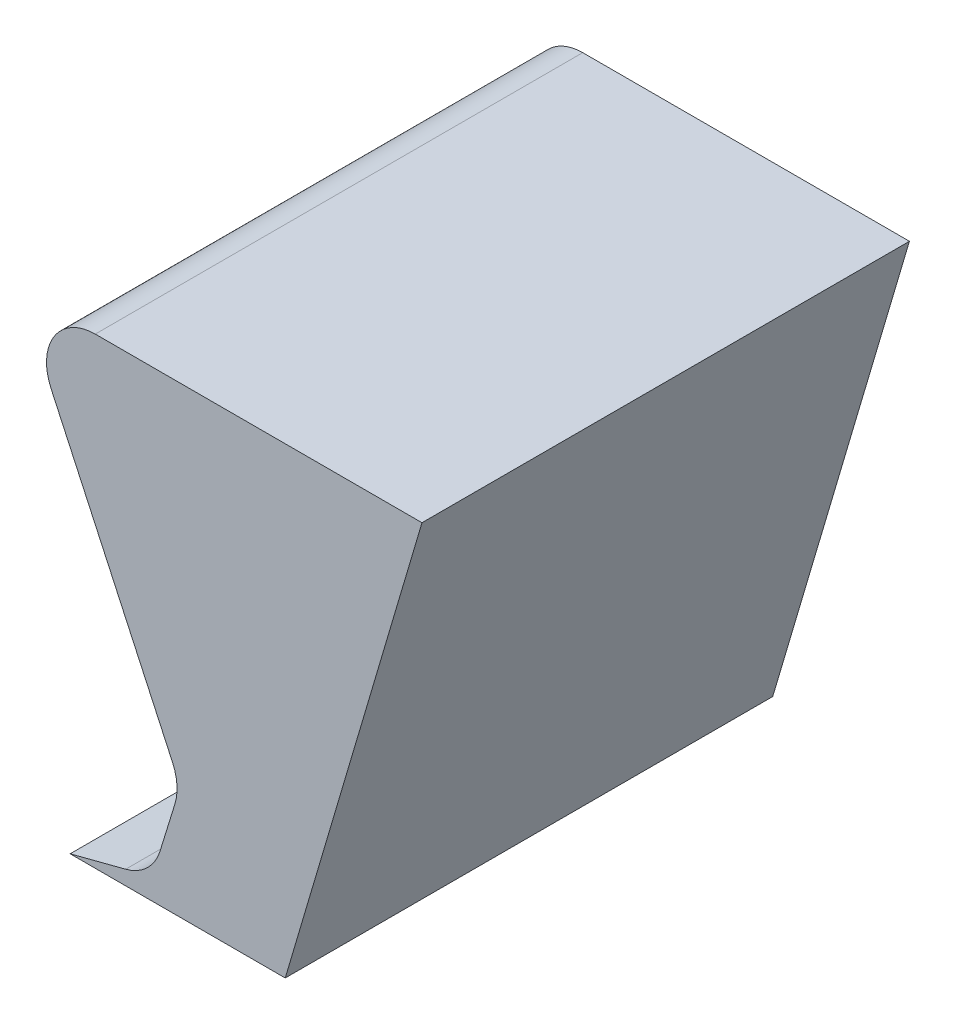
ISO-10303-21;
HEADER;
FILE_DESCRIPTION(('STEP AP214'),'2;1');
FILE_NAME('part.step','',(''),(''),'','','');
FILE_SCHEMA(('AUTOMOTIVE_DESIGN { 1 0 10303 214 1 1 1 1 }'));
ENDSEC;
DATA;
#1=APPLICATION_CONTEXT('core data for automotive mechanical design processes');
#2=APPLICATION_PROTOCOL_DEFINITION('international standard','automotive_design',2000,#1);
#3=PRODUCT_CONTEXT('',#1,'mechanical');
#4=PRODUCT('Part','Part','',(#3));
#5=PRODUCT_RELATED_PRODUCT_CATEGORY('part','',(#4));
#6=PRODUCT_DEFINITION_FORMATION('','',#4);
#7=PRODUCT_DEFINITION_CONTEXT('part definition',#1,'design');
#8=PRODUCT_DEFINITION('design','',#6,#7);
#9=PRODUCT_DEFINITION_SHAPE('','',#8);
#10=(LENGTH_UNIT() NAMED_UNIT(*) SI_UNIT(.MILLI.,.METRE.));
#11=(NAMED_UNIT(*) PLANE_ANGLE_UNIT() SI_UNIT($,.RADIAN.));
#12=(NAMED_UNIT(*) SI_UNIT($,.STERADIAN.) SOLID_ANGLE_UNIT());
#13=UNCERTAINTY_MEASURE_WITH_UNIT(LENGTH_MEASURE(1.E-05),#10,'distance_accuracy_value','');
#14=(GEOMETRIC_REPRESENTATION_CONTEXT(3) GLOBAL_UNCERTAINTY_ASSIGNED_CONTEXT((#13)) GLOBAL_UNIT_ASSIGNED_CONTEXT((#10,
#11,#12)) REPRESENTATION_CONTEXT('',''));
#15=CARTESIAN_POINT('',(0.,0.,0.));
#16=DIRECTION('',(0.,0.,1.));
#17=DIRECTION('',(1.,0.,0.));
#18=AXIS2_PLACEMENT_3D('',#15,#16,#17);
#19=CARTESIAN_POINT('',(-2.322032823295,-1.888104528849,0.));
#20=DIRECTION('',(0.,0.,1.));
#21=DIRECTION('',(0.69099336840186,-0.722861096494099,0.));
#22=AXIS2_PLACEMENT_3D('',#19,#20,#21);
#23=CYLINDRICAL_SURFACE('',#22,0.01);
#24=CARTESIAN_POINT('',(-2.322032823295,-1.888104528849,0.));
#25=DIRECTION('',(0.,0.,-1.));
#26=DIRECTION('',(0.69099336840186,-0.722861096494099,0.));
#27=AXIS2_PLACEMENT_3D('',#24,#25,#26);
#28=CIRCLE('',#27,0.01);
#29=CARTESIAN_POINT('',(-2.312477161526,-1.891052295487,0.));
#30=VERTEX_POINT('',#29);
#31=CARTESIAN_POINT('',(-2.319518593314,-1.897783301891,0.));
#32=VERTEX_POINT('',#31);
#33=EDGE_CURVE('E11',#30,#32,#28,.T.);
#34=ORIENTED_EDGE('',*,*,#33,.T.);
#35=DIRECTION('',(0.,0.,1.));
#36=VECTOR('',#35,1.);
#37=CARTESIAN_POINT('',(-2.319518593314,-1.897783301891,0.));
#38=LINE('',#37,#36);
#39=CARTESIAN_POINT('',(-2.319518593314,-1.897783301891,0.1));
#40=VERTEX_POINT('',#39);
#41=EDGE_CURVE('E24',#32,#40,#38,.T.);
#42=ORIENTED_EDGE('',*,*,#41,.T.);
#43=CARTESIAN_POINT('',(-2.322032823295,-1.888104528849,0.1));
#44=DIRECTION('',(0.,0.,1.));
#45=DIRECTION('',(0.69099336840186,-0.722861096494099,0.));
#46=AXIS2_PLACEMENT_3D('',#43,#44,#45);
#47=CIRCLE('',#46,0.01);
#48=CARTESIAN_POINT('',(-2.312477161526,-1.891052295487,0.1));
#49=VERTEX_POINT('',#48);
#50=EDGE_CURVE('E160',#40,#49,#47,.T.);
#51=ORIENTED_EDGE('',*,*,#50,.T.);
#52=DIRECTION('',(0.,0.,-1.));
#53=VECTOR('',#52,1.);
#54=CARTESIAN_POINT('',(-2.312477161526,-1.891052295487,0.));
#55=LINE('',#54,#53);
#56=EDGE_CURVE('E36',#49,#30,#55,.T.);
#57=ORIENTED_EDGE('',*,*,#56,.T.);
#58=EDGE_LOOP('',(#34,#42,#51,#57));
#59=FACE_BOUND('',#58,.T.);
#60=ADVANCED_FACE('F17',(#59),#23,.F.);
#61=CARTESIAN_POINT('',(-2.314121040074,-1.896381193368,0.));
#62=DIRECTION('',(-0.251422998089573,0.967877304223862,0.));
#63=DIRECTION('',(-0.967877304223862,-0.251422998089573,0.));
#64=AXIS2_PLACEMENT_3D('',#61,#62,#63);
#65=PLANE('',#64);
#66=ORIENTED_EDGE('',*,*,#41,.F.);
#67=DIRECTION('',(-0.967877304223862,-0.251422998089573,0.));
#68=VECTOR('',#67,1.);
#69=CARTESIAN_POINT('',(-2.314121040074,-1.896381193368,0.));
#70=LINE('',#69,#68);
#71=CARTESIAN_POINT('',(-2.33092192226,-1.900745515324,0.));
#72=VERTEX_POINT('',#71);
#73=EDGE_CURVE('E157',#32,#72,#70,.T.);
#74=ORIENTED_EDGE('',*,*,#73,.T.);
#75=DIRECTION('',(0.,0.,1.));
#76=VECTOR('',#75,1.);
#77=CARTESIAN_POINT('',(-2.33092192226,-1.900745515324,0.));
#78=LINE('',#77,#76);
#79=CARTESIAN_POINT('',(-2.33092192226,-1.900745515324,0.1));
#80=VERTEX_POINT('',#79);
#81=EDGE_CURVE('E109',#72,#80,#78,.T.);
#82=ORIENTED_EDGE('',*,*,#81,.T.);
#83=DIRECTION('',(-0.967877304223862,-0.251422998089573,0.));
#84=VECTOR('',#83,1.);
#85=CARTESIAN_POINT('',(-2.314121040074,-1.896381193368,0.1));
#86=LINE('',#85,#84);
#87=EDGE_CURVE('E153',#40,#80,#86,.T.);
#88=ORIENTED_EDGE('',*,*,#87,.F.);
#89=EDGE_LOOP('',(#66,#74,#82,#88));
#90=FACE_BOUND('',#89,.T.);
#91=ADVANCED_FACE('F161',(#90),#65,.T.);
#92=CARTESIAN_POINT('',(-2.318981173884,-1.878212114289,0.));
#93=DIRECTION('',(0.,0.,1.));
#94=DIRECTION('',(0.997774022680353,0.066685828061636,0.));
#95=AXIS2_PLACEMENT_3D('',#92,#93,#94);
#96=CYLINDRICAL_SURFACE('',#95,0.01);
#97=CARTESIAN_POINT('',(-2.318981173884,-1.878212114289,0.));
#98=DIRECTION('',(0.,0.,-1.));
#99=DIRECTION('',(0.997774022680353,0.066685828061636,0.));
#100=AXIS2_PLACEMENT_3D('',#97,#98,#99);
#101=CIRCLE('',#100,0.01);
#102=CARTESIAN_POINT('',(-2.309902773543,-1.874018947556,0.));
#103=VERTEX_POINT('',#102);
#104=CARTESIAN_POINT('',(-2.309425512115,-1.881159880927,0.));
#105=VERTEX_POINT('',#104);
#106=EDGE_CURVE('E150',#103,#105,#101,.T.);
#107=ORIENTED_EDGE('',*,*,#106,.T.);
#108=DIRECTION('',(0.,0.,1.));
#109=VECTOR('',#108,1.);
#110=CARTESIAN_POINT('',(-2.309425512115,-1.881159880927,0.));
#111=LINE('',#110,#109);
#112=CARTESIAN_POINT('',(-2.309425512115,-1.881159880927,0.1));
#113=VERTEX_POINT('',#112);
#114=EDGE_CURVE('E147',#105,#113,#111,.T.);
#115=ORIENTED_EDGE('',*,*,#114,.T.);
#116=CARTESIAN_POINT('',(-2.318981173884,-1.878212114289,0.1));
#117=DIRECTION('',(0.,0.,1.));
#118=DIRECTION('',(0.997774022680353,0.066685828061636,0.));
#119=AXIS2_PLACEMENT_3D('',#116,#117,#118);
#120=CIRCLE('',#119,0.01);
#121=CARTESIAN_POINT('',(-2.309902773543,-1.874018947556,0.1));
#122=VERTEX_POINT('',#121);
#123=EDGE_CURVE('E144',#113,#122,#120,.T.);
#124=ORIENTED_EDGE('',*,*,#123,.T.);
#125=DIRECTION('',(0.,0.,-1.));
#126=VECTOR('',#125,1.);
#127=CARTESIAN_POINT('',(-2.309902773543,-1.874018947556,0.));
#128=LINE('',#127,#126);
#129=EDGE_CURVE('E142',#122,#103,#128,.T.);
#130=ORIENTED_EDGE('',*,*,#129,.T.);
#131=EDGE_LOOP('',(#107,#115,#124,#130));
#132=FACE_BOUND('',#131,.T.);
#133=ADVANCED_FACE('F194',(#132),#96,.F.);
#134=CARTESIAN_POINT('',(-2.308295870868,-1.877497966332,0.));
#135=DIRECTION('',(-0.955566176917726,0.294776663816594,0.));
#136=DIRECTION('',(-0.294776663816594,-0.955566176917726,0.));
#137=AXIS2_PLACEMENT_3D('',#134,#135,#136);
#138=PLANE('',#137);
#139=ORIENTED_EDGE('',*,*,#56,.F.);
#140=DIRECTION('',(-0.294776663816594,-0.955566176917726,0.));
#141=VECTOR('',#140,1.);
#142=CARTESIAN_POINT('',(-2.308295870868,-1.877497966332,0.1));
#143=LINE('',#142,#141);
#144=EDGE_CURVE('E139',#113,#49,#143,.T.);
#145=ORIENTED_EDGE('',*,*,#144,.F.);
#146=ORIENTED_EDGE('',*,*,#114,.F.);
#147=DIRECTION('',(-0.294776663816594,-0.955566176917726,0.));
#148=VECTOR('',#147,1.);
#149=CARTESIAN_POINT('',(-2.308295870868,-1.877497966332,0.));
#150=LINE('',#149,#148);
#151=EDGE_CURVE('E136',#105,#30,#150,.T.);
#152=ORIENTED_EDGE('',*,*,#151,.T.);
#153=EDGE_LOOP('',(#139,#145,#146,#152));
#154=FACE_BOUND('',#153,.T.);
#155=ADVANCED_FACE('F166',(#154),#138,.T.);
#156=CARTESIAN_POINT('',(-2.325763158544,-1.815832154574,0.));
#157=DIRECTION('',(0.,0.,1.));
#158=DIRECTION('',(-0.842412213008179,0.538833613812894,0.));
#159=AXIS2_PLACEMENT_3D('',#156,#157,#158);
#160=CYLINDRICAL_SURFACE('',#159,0.01);
#161=CARTESIAN_POINT('',(-2.325763158544,-1.815832154574,0.1));
#162=DIRECTION('',(0.,0.,-1.));
#163=DIRECTION('',(-0.842412213008179,0.538833613812894,0.));
#164=AXIS2_PLACEMENT_3D('',#161,#162,#163);
#165=CIRCLE('',#164,0.01);
#166=CARTESIAN_POINT('',(-2.334841558885,-1.820025321306,0.1));
#167=VERTEX_POINT('',#166);
#168=CARTESIAN_POINT('',(-2.325763158544,-1.805832154574,0.1));
#169=VERTEX_POINT('',#168);
#170=EDGE_CURVE('E134',#167,#169,#165,.T.);
#171=ORIENTED_EDGE('',*,*,#170,.T.);
#172=DIRECTION('',(0.,0.,-1.));
#173=VECTOR('',#172,1.);
#174=CARTESIAN_POINT('',(-2.325763158544,-1.805832154574,0.));
#175=LINE('',#174,#173);
#176=CARTESIAN_POINT('',(-2.325763158544,-1.805832154574,0.));
#177=VERTEX_POINT('',#176);
#178=EDGE_CURVE('E132',#169,#177,#175,.T.);
#179=ORIENTED_EDGE('',*,*,#178,.T.);
#180=CARTESIAN_POINT('',(-2.325763158544,-1.815832154574,0.));
#181=DIRECTION('',(0.,0.,1.));
#182=DIRECTION('',(-0.842412213008179,0.538833613812894,0.));
#183=AXIS2_PLACEMENT_3D('',#180,#181,#182);
#184=CIRCLE('',#183,0.01);
#185=CARTESIAN_POINT('',(-2.334841558885,-1.820025321306,0.));
#186=VERTEX_POINT('',#185);
#187=EDGE_CURVE('E130',#177,#186,#184,.T.);
#188=ORIENTED_EDGE('',*,*,#187,.T.);
#189=DIRECTION('',(0.,0.,1.));
#190=VECTOR('',#189,1.);
#191=CARTESIAN_POINT('',(-2.334841558885,-1.820025321306,0.));
#192=LINE('',#191,#190);
#193=EDGE_CURVE('E127',#186,#167,#192,.T.);
#194=ORIENTED_EDGE('',*,*,#193,.T.);
#195=EDGE_LOOP('',(#171,#179,#188,#194));
#196=FACE_BOUND('',#195,.T.);
#197=ADVANCED_FACE('F176',(#196),#160,.T.);
#198=CARTESIAN_POINT('',(-2.300803726353,-1.849500161908,0.1));
#199=DIRECTION('',(0.,0.,1.));
#200=DIRECTION('',(1.,0.,0.));
#201=AXIS2_PLACEMENT_3D('',#198,#199,#200);
#202=PLANE('',#201);
#203=ORIENTED_EDGE('',*,*,#170,.F.);
#204=DIRECTION('',(0.419316673250586,-0.907840034110669,0.));
#205=VECTOR('',#204,1.);
#206=CARTESIAN_POINT('',(-2.341397153741,-1.805832154574,0.1));
#207=LINE('',#206,#205);
#208=EDGE_CURVE('E124',#167,#122,#207,.T.);
#209=ORIENTED_EDGE('',*,*,#208,.T.);
#210=ORIENTED_EDGE('',*,*,#123,.F.);
#211=ORIENTED_EDGE('',*,*,#144,.T.);
#212=ORIENTED_EDGE('',*,*,#50,.F.);
#213=ORIENTED_EDGE('',*,*,#87,.T.);
#214=DIRECTION('',(1.,0.,0.));
#215=VECTOR('',#214,1.);
#216=CARTESIAN_POINT('',(-2.33092192226,-1.900745515324,0.1));
#217=LINE('',#216,#215);
#218=CARTESIAN_POINT('',(-2.286790058151,-1.900745515324,0.1));
#219=VERTEX_POINT('',#218);
#220=EDGE_CURVE('E122',#80,#219,#217,.T.);
#221=ORIENTED_EDGE('',*,*,#220,.T.);
#222=DIRECTION('',(0.283427278082506,0.958993732012228,0.));
#223=VECTOR('',#222,1.);
#224=CARTESIAN_POINT('',(-2.286790058151,-1.900745515324,0.1));
#225=LINE('',#224,#223);
#226=CARTESIAN_POINT('',(-2.258738742909,-1.805832154574,0.1));
#227=VERTEX_POINT('',#226);
#228=EDGE_CURVE('E103',#219,#227,#225,.T.);
#229=ORIENTED_EDGE('',*,*,#228,.T.);
#230=DIRECTION('',(-1.,0.,0.));
#231=VECTOR('',#230,1.);
#232=CARTESIAN_POINT('',(-2.258738742909,-1.805832154574,0.1));
#233=LINE('',#232,#231);
#234=EDGE_CURVE('E118',#227,#169,#233,.T.);
#235=ORIENTED_EDGE('',*,*,#234,.T.);
#236=EDGE_LOOP('',(#203,#209,#210,#211,#212,#213,#221,#229,#235));
#237=FACE_BOUND('',#236,.T.);
#238=ADVANCED_FACE('F163',(#237),#202,.T.);
#239=CARTESIAN_POINT('',(-2.341397153741,-1.805832154574,0.));
#240=DIRECTION('',(-0.907840034110669,-0.419316673250586,0.));
#241=DIRECTION('',(0.419316673250586,-0.907840034110669,0.));
#242=AXIS2_PLACEMENT_3D('',#239,#240,#241);
#243=PLANE('',#242);
#244=ORIENTED_EDGE('',*,*,#129,.F.);
#245=ORIENTED_EDGE('',*,*,#208,.F.);
#246=ORIENTED_EDGE('',*,*,#193,.F.);
#247=DIRECTION('',(0.419316673250586,-0.907840034110669,0.));
#248=VECTOR('',#247,1.);
#249=CARTESIAN_POINT('',(-2.341397153741,-1.805832154574,0.));
#250=LINE('',#249,#248);
#251=EDGE_CURVE('E115',#186,#103,#250,.T.);
#252=ORIENTED_EDGE('',*,*,#251,.T.);
#253=EDGE_LOOP('',(#244,#245,#246,#252));
#254=FACE_BOUND('',#253,.T.);
#255=ADVANCED_FACE('F173',(#254),#243,.T.);
#256=CARTESIAN_POINT('',(-2.258738742909,-1.805832154574,0.));
#257=DIRECTION('',(0.,1.,0.));
#258=DIRECTION('',(-1.,0.,0.));
#259=AXIS2_PLACEMENT_3D('',#256,#257,#258);
#260=PLANE('',#259);
#261=ORIENTED_EDGE('',*,*,#178,.F.);
#262=ORIENTED_EDGE('',*,*,#234,.F.);
#263=DIRECTION('',(0.,0.,1.));
#264=VECTOR('',#263,1.);
#265=CARTESIAN_POINT('',(-2.258738742909,-1.805832154574,0.));
#266=LINE('',#265,#264);
#267=CARTESIAN_POINT('',(-2.258738742909,-1.805832154574,0.));
#268=VERTEX_POINT('',#267);
#269=EDGE_CURVE('E113',#268,#227,#266,.T.);
#270=ORIENTED_EDGE('',*,*,#269,.F.);
#271=DIRECTION('',(-1.,0.,0.));
#272=VECTOR('',#271,1.);
#273=CARTESIAN_POINT('',(-2.258738742909,-1.805832154574,0.));
#274=LINE('',#273,#272);
#275=EDGE_CURVE('E95',#268,#177,#274,.T.);
#276=ORIENTED_EDGE('',*,*,#275,.T.);
#277=EDGE_LOOP('',(#261,#262,#270,#276));
#278=FACE_BOUND('',#277,.T.);
#279=ADVANCED_FACE('F179',(#278),#260,.T.);
#280=CARTESIAN_POINT('',(-2.286790058151,-1.900745515324,0.));
#281=DIRECTION('',(0.958993732012229,-0.283427278082506,0.));
#282=DIRECTION('',(0.283427278082506,0.958993732012229,0.));
#283=AXIS2_PLACEMENT_3D('',#280,#281,#282);
#284=PLANE('',#283);
#285=DIRECTION('',(0.283427278082506,0.958993732012228,0.));
#286=VECTOR('',#285,1.);
#287=CARTESIAN_POINT('',(-2.286790058151,-1.900745515324,0.));
#288=LINE('',#287,#286);
#289=CARTESIAN_POINT('',(-2.286790058151,-1.900745515324,0.));
#290=VERTEX_POINT('',#289);
#291=EDGE_CURVE('E87',#290,#268,#288,.T.);
#292=ORIENTED_EDGE('',*,*,#291,.T.);
#293=ORIENTED_EDGE('',*,*,#269,.T.);
#294=ORIENTED_EDGE('',*,*,#228,.F.);
#295=DIRECTION('',(0.,0.,1.));
#296=VECTOR('',#295,1.);
#297=CARTESIAN_POINT('',(-2.286790058151,-1.900745515324,0.));
#298=LINE('',#297,#296);
#299=EDGE_CURVE('E98',#290,#219,#298,.T.);
#300=ORIENTED_EDGE('',*,*,#299,.F.);
#301=EDGE_LOOP('',(#292,#293,#294,#300));
#302=FACE_BOUND('',#301,.T.);
#303=ADVANCED_FACE('F102',(#302),#284,.T.);
#304=CARTESIAN_POINT('',(-2.33092192226,-1.900745515324,0.));
#305=DIRECTION('',(0.,-1.,0.));
#306=DIRECTION('',(1.,0.,0.));
#307=AXIS2_PLACEMENT_3D('',#304,#305,#306);
#308=PLANE('',#307);
#309=DIRECTION('',(1.,0.,0.));
#310=VECTOR('',#309,1.);
#311=CARTESIAN_POINT('',(-2.33092192226,-1.900745515324,0.));
#312=LINE('',#311,#310);
#313=EDGE_CURVE('E93',#72,#290,#312,.T.);
#314=ORIENTED_EDGE('',*,*,#313,.T.);
#315=ORIENTED_EDGE('',*,*,#299,.T.);
#316=ORIENTED_EDGE('',*,*,#220,.F.);
#317=ORIENTED_EDGE('',*,*,#81,.F.);
#318=EDGE_LOOP('',(#314,#315,#316,#317));
#319=FACE_BOUND('',#318,.T.);
#320=ADVANCED_FACE('F108',(#319),#308,.T.);
#321=CARTESIAN_POINT('',(-2.300803726353,-1.849500161908,0.));
#322=DIRECTION('',(0.,0.,1.));
#323=DIRECTION('',(1.,0.,0.));
#324=AXIS2_PLACEMENT_3D('',#321,#322,#323);
#325=PLANE('',#324);
#326=ORIENTED_EDGE('',*,*,#187,.F.);
#327=ORIENTED_EDGE('',*,*,#275,.F.);
#328=ORIENTED_EDGE('',*,*,#291,.F.);
#329=ORIENTED_EDGE('',*,*,#313,.F.);
#330=ORIENTED_EDGE('',*,*,#73,.F.);
#331=ORIENTED_EDGE('',*,*,#33,.F.);
#332=ORIENTED_EDGE('',*,*,#151,.F.);
#333=ORIENTED_EDGE('',*,*,#106,.F.);
#334=ORIENTED_EDGE('',*,*,#251,.F.);
#335=EDGE_LOOP('',(#326,#327,#328,#329,#330,#331,#332,#333,#334));
#336=FACE_BOUND('',#335,.T.);
#337=ADVANCED_FACE('F90',(#336),#325,.F.);
#338=CLOSED_SHELL('',(#60,#91,#133,#155,#197,#238,#255,#279,#303,#320,#337));
#339=MANIFOLD_SOLID_BREP('B1',#338);
#340=ADVANCED_BREP_SHAPE_REPRESENTATION('',(#18,#339),#14);
#341=SHAPE_DEFINITION_REPRESENTATION(#9,#340);
ENDSEC;
END-ISO-10303-21;
